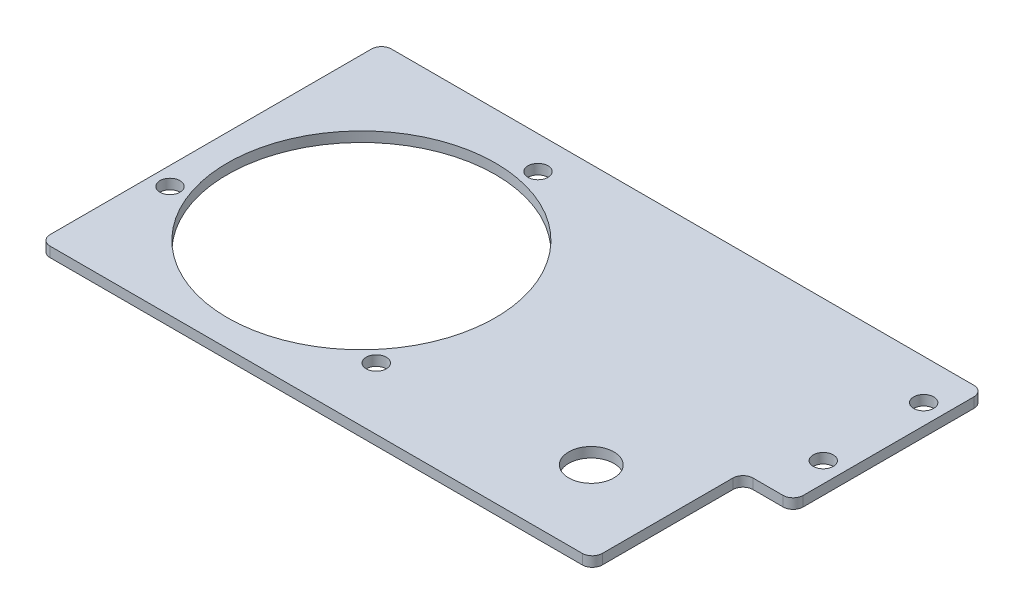
ISO-10303-21;
HEADER;
FILE_DESCRIPTION(('STEP AP214'),'2;1');
FILE_NAME('part.step','',(''),(''),'','','');
FILE_SCHEMA(('AUTOMOTIVE_DESIGN { 1 0 10303 214 1 1 1 1 }'));
ENDSEC;
DATA;
#1=APPLICATION_CONTEXT('core data for automotive mechanical design processes');
#2=APPLICATION_PROTOCOL_DEFINITION('international standard','automotive_design',2000,#1);
#3=PRODUCT_CONTEXT('',#1,'mechanical');
#4=PRODUCT('Part','Part','',(#3));
#5=PRODUCT_RELATED_PRODUCT_CATEGORY('part','',(#4));
#6=PRODUCT_DEFINITION_FORMATION('','',#4);
#7=PRODUCT_DEFINITION_CONTEXT('part definition',#1,'design');
#8=PRODUCT_DEFINITION('design','',#6,#7);
#9=PRODUCT_DEFINITION_SHAPE('','',#8);
#10=(LENGTH_UNIT() NAMED_UNIT(*) SI_UNIT(.MILLI.,.METRE.));
#11=(NAMED_UNIT(*) PLANE_ANGLE_UNIT() SI_UNIT($,.RADIAN.));
#12=(NAMED_UNIT(*) SI_UNIT($,.STERADIAN.) SOLID_ANGLE_UNIT());
#13=UNCERTAINTY_MEASURE_WITH_UNIT(LENGTH_MEASURE(1.E-05),#10,'distance_accuracy_value','');
#14=(GEOMETRIC_REPRESENTATION_CONTEXT(3) GLOBAL_UNCERTAINTY_ASSIGNED_CONTEXT((#13)) GLOBAL_UNIT_ASSIGNED_CONTEXT((#10,
#11,#12)) REPRESENTATION_CONTEXT('',''));
#15=CARTESIAN_POINT('',(0.,0.,0.));
#16=DIRECTION('',(0.,0.,1.));
#17=DIRECTION('',(1.,0.,0.));
#18=AXIS2_PLACEMENT_3D('',#15,#16,#17);
#19=CARTESIAN_POINT('',(254.,6.35,12.7));
#20=DIRECTION('',(0.,-1.,0.));
#21=DIRECTION('',(0.,0.,-1.));
#22=AXIS2_PLACEMENT_3D('',#19,#20,#21);
#23=PLANE('',#22);
#24=CARTESIAN_POINT('',(195.686680000023,6.35,50.2920000000027));
#25=DIRECTION('',(0.,1.,0.));
#26=DIRECTION('',(0.,0.,1.));
#27=AXIS2_PLACEMENT_3D('',#24,#25,#26);
#28=CIRCLE('',#27,14.2875);
#29=CARTESIAN_POINT('',(195.686680000023,6.35,64.5795000000027));
#30=VERTEX_POINT('',#29);
#31=EDGE_CURVE('E299',#30,#30,#28,.T.);
#32=ORIENTED_EDGE('',*,*,#31,.F.);
#33=EDGE_LOOP('',(#32));
#34=FACE_BOUND('',#33,.T.);
#35=CARTESIAN_POINT('',(18.1745568096169,6.35,-93.4999892233898));
#36=DIRECTION('',(0.,1.,0.));
#37=DIRECTION('',(0.,0.,1.));
#38=AXIS2_PLACEMENT_3D('',#35,#36,#37);
#39=CIRCLE('',#38,6.34999999999998);
#40=CARTESIAN_POINT('',(18.1745568096169,6.35,-87.1499892233898));
#41=VERTEX_POINT('',#40);
#42=EDGE_CURVE('E309',#41,#41,#39,.T.);
#43=ORIENTED_EDGE('',*,*,#42,.F.);
#44=EDGE_LOOP('',(#43));
#45=FACE_BOUND('',#44,.T.);
#46=CARTESIAN_POINT('',(266.7,6.35,-88.9000000000001));
#47=DIRECTION('',(0.,1.,0.));
#48=DIRECTION('',(0.,0.,1.));
#49=AXIS2_PLACEMENT_3D('',#46,#47,#48);
#50=CIRCLE('',#49,6.35);
#51=CARTESIAN_POINT('',(266.7,6.35,-82.5500000000001));
#52=VERTEX_POINT('',#51);
#53=EDGE_CURVE('E321',#52,#52,#50,.T.);
#54=ORIENTED_EDGE('',*,*,#53,.F.);
#55=EDGE_LOOP('',(#54));
#56=FACE_BOUND('',#55,.T.);
#57=CARTESIAN_POINT('',(0.,6.35,0.));
#58=DIRECTION('',(0.,1.,0.));
#59=DIRECTION('',(0.,0.,1.));
#60=AXIS2_PLACEMENT_3D('',#57,#58,#59);
#61=CIRCLE('',#60,84.7725);
#62=CARTESIAN_POINT('',(0.,6.35,84.7725));
#63=VERTEX_POINT('',#62);
#64=EDGE_CURVE('E159',#63,#63,#61,.T.);
#65=ORIENTED_EDGE('',*,*,#64,.F.);
#66=EDGE_LOOP('',(#65));
#67=FACE_BOUND('',#66,.T.);
#68=CARTESIAN_POINT('',(254.,6.35,12.7));
#69=DIRECTION('',(0.,-1.,0.));
#70=DIRECTION('',(0.,0.,-1.));
#71=AXIS2_PLACEMENT_3D('',#68,#69,#70);
#72=CIRCLE('',#71,6.35);
#73=CARTESIAN_POINT('',(247.65,6.35,12.7));
#74=VERTEX_POINT('',#73);
#75=CARTESIAN_POINT('',(254.,6.35,6.34999999999998));
#76=VERTEX_POINT('',#75);
#77=EDGE_CURVE('E178',#74,#76,#72,.T.);
#78=ORIENTED_EDGE('',*,*,#77,.T.);
#79=DIRECTION('',(1.,0.,0.));
#80=VECTOR('',#79,1.);
#81=CARTESIAN_POINT('',(254.,6.35,6.34999999999998));
#82=LINE('',#81,#80);
#83=CARTESIAN_POINT('',(273.05,6.35,6.34999999999999));
#84=VERTEX_POINT('',#83);
#85=EDGE_CURVE('E106',#76,#84,#82,.T.);
#86=ORIENTED_EDGE('',*,*,#85,.T.);
#87=CARTESIAN_POINT('',(273.05,6.35,0.));
#88=DIRECTION('',(0.,1.,0.));
#89=DIRECTION('',(0.,0.,1.));
#90=AXIS2_PLACEMENT_3D('',#87,#88,#89);
#91=CIRCLE('',#90,6.35000000000001);
#92=CARTESIAN_POINT('',(279.4,6.35,0.));
#93=VERTEX_POINT('',#92);
#94=EDGE_CURVE('E206',#84,#93,#91,.T.);
#95=ORIENTED_EDGE('',*,*,#94,.T.);
#96=DIRECTION('',(0.,0.,-1.));
#97=VECTOR('',#96,1.);
#98=CARTESIAN_POINT('',(279.4,6.35,-107.95));
#99=LINE('',#98,#97);
#100=CARTESIAN_POINT('',(279.4,6.35,-107.95));
#101=VERTEX_POINT('',#100);
#102=EDGE_CURVE('E225',#93,#101,#99,.T.);
#103=ORIENTED_EDGE('',*,*,#102,.T.);
#104=CARTESIAN_POINT('',(273.05,6.35,-107.95));
#105=DIRECTION('',(0.,1.,0.));
#106=DIRECTION('',(0.,0.,-1.));
#107=AXIS2_PLACEMENT_3D('',#104,#105,#106);
#108=CIRCLE('',#107,6.35000000000002);
#109=CARTESIAN_POINT('',(273.05,6.35,-114.3));
#110=VERTEX_POINT('',#109);
#111=EDGE_CURVE('E222',#101,#110,#108,.T.);
#112=ORIENTED_EDGE('',*,*,#111,.T.);
#113=DIRECTION('',(-1.,0.,0.));
#114=VECTOR('',#113,1.);
#115=CARTESIAN_POINT('',(273.05,6.35,-114.3));
#116=LINE('',#115,#114);
#117=CARTESIAN_POINT('',(-95.25,6.35,-114.3));
#118=VERTEX_POINT('',#117);
#119=EDGE_CURVE('E224',#110,#118,#116,.T.);
#120=ORIENTED_EDGE('',*,*,#119,.T.);
#121=CARTESIAN_POINT('',(-95.25,6.35,-107.95));
#122=DIRECTION('',(0.,1.,0.));
#123=DIRECTION('',(0.,0.,1.));
#124=AXIS2_PLACEMENT_3D('',#121,#122,#123);
#125=CIRCLE('',#124,6.35);
#126=CARTESIAN_POINT('',(-101.6,6.35,-107.95));
#127=VERTEX_POINT('',#126);
#128=EDGE_CURVE('E227',#118,#127,#125,.T.);
#129=ORIENTED_EDGE('',*,*,#128,.T.);
#130=DIRECTION('',(0.,0.,1.));
#131=VECTOR('',#130,1.);
#132=CARTESIAN_POINT('',(-101.6,6.35,-107.95));
#133=LINE('',#132,#131);
#134=CARTESIAN_POINT('',(-101.6,6.35,95.25));
#135=VERTEX_POINT('',#134);
#136=EDGE_CURVE('E233',#127,#135,#133,.T.);
#137=ORIENTED_EDGE('',*,*,#136,.T.);
#138=CARTESIAN_POINT('',(-95.2499999999999,6.35,95.2500000000001));
#139=DIRECTION('',(0.,1.,0.));
#140=DIRECTION('',(0.,0.,-1.));
#141=AXIS2_PLACEMENT_3D('',#138,#139,#140);
#142=CIRCLE('',#141,6.34999999999999);
#143=CARTESIAN_POINT('',(-95.2499999999999,6.35,101.6));
#144=VERTEX_POINT('',#143);
#145=EDGE_CURVE('E137',#135,#144,#142,.T.);
#146=ORIENTED_EDGE('',*,*,#145,.T.);
#147=DIRECTION('',(1.,0.,0.));
#148=VECTOR('',#147,1.);
#149=CARTESIAN_POINT('',(241.3,6.35,101.6));
#150=LINE('',#149,#148);
#151=CARTESIAN_POINT('',(241.3,6.35,101.6));
#152=VERTEX_POINT('',#151);
#153=EDGE_CURVE('E131',#144,#152,#150,.T.);
#154=ORIENTED_EDGE('',*,*,#153,.T.);
#155=CARTESIAN_POINT('',(241.3,6.35,95.25));
#156=DIRECTION('',(0.,1.,0.));
#157=DIRECTION('',(0.,0.,1.));
#158=AXIS2_PLACEMENT_3D('',#155,#156,#157);
#159=CIRCLE('',#158,6.34999999999999);
#160=CARTESIAN_POINT('',(247.65,6.35,95.25));
#161=VERTEX_POINT('',#160);
#162=EDGE_CURVE('E135',#152,#161,#159,.T.);
#163=ORIENTED_EDGE('',*,*,#162,.T.);
#164=DIRECTION('',(0.,0.,-1.));
#165=VECTOR('',#164,1.);
#166=CARTESIAN_POINT('',(247.65,6.35,95.25));
#167=LINE('',#166,#165);
#168=EDGE_CURVE('E51',#161,#74,#167,.T.);
#169=ORIENTED_EDGE('',*,*,#168,.T.);
#170=EDGE_LOOP('',(#78,#86,#95,#103,#112,#120,#129,#137,#146,#154,#163,#169));
#171=FACE_BOUND('',#170,.T.);
#172=CARTESIAN_POINT('',(-90.0606443258351,6.35,31.0103667120436));
#173=DIRECTION('',(0.,1.,0.));
#174=DIRECTION('',(0.,0.,1.));
#175=AXIS2_PLACEMENT_3D('',#172,#173,#174);
#176=CIRCLE('',#175,6.35);
#177=CARTESIAN_POINT('',(-90.0606443258351,6.35,37.3603667120436));
#178=VERTEX_POINT('',#177);
#179=EDGE_CURVE('E327',#178,#178,#176,.T.);
#180=ORIENTED_EDGE('',*,*,#179,.F.);
#181=EDGE_LOOP('',(#180));
#182=FACE_BOUND('',#181,.T.);
#183=CARTESIAN_POINT('',(266.7,6.35,-25.4000000000001));
#184=DIRECTION('',(0.,1.,0.));
#185=DIRECTION('',(0.,0.,1.));
#186=AXIS2_PLACEMENT_3D('',#183,#184,#185);
#187=CIRCLE('',#186,6.35);
#188=CARTESIAN_POINT('',(266.7,6.35,-19.0500000000001));
#189=VERTEX_POINT('',#188);
#190=EDGE_CURVE('E315',#189,#189,#187,.T.);
#191=ORIENTED_EDGE('',*,*,#190,.F.);
#192=EDGE_LOOP('',(#191));
#193=FACE_BOUND('',#192,.T.);
#194=CARTESIAN_POINT('',(71.8860875162181,6.35,62.4896225113469));
#195=DIRECTION('',(0.,1.,0.));
#196=DIRECTION('',(0.,0.,1.));
#197=AXIS2_PLACEMENT_3D('',#194,#195,#196);
#198=CIRCLE('',#197,6.35);
#199=CARTESIAN_POINT('',(71.8860875162181,6.35,68.8396225113469));
#200=VERTEX_POINT('',#199);
#201=EDGE_CURVE('E303',#200,#200,#198,.T.);
#202=ORIENTED_EDGE('',*,*,#201,.F.);
#203=EDGE_LOOP('',(#202));
#204=FACE_BOUND('',#203,.T.);
#205=ADVANCED_FACE('F33',(#34,#45,#56,#67,#171,#182,#193,#204),#23,.F.);
#206=CARTESIAN_POINT('',(254.,0.,12.7));
#207=DIRECTION('',(0.,-1.,0.));
#208=DIRECTION('',(0.,0.,-1.));
#209=AXIS2_PLACEMENT_3D('',#206,#207,#208);
#210=PLANE('',#209);
#211=CARTESIAN_POINT('',(195.686680000023,0.,50.2920000000027));
#212=DIRECTION('',(0.,-1.,0.));
#213=DIRECTION('',(0.,0.,-1.));
#214=AXIS2_PLACEMENT_3D('',#211,#212,#213);
#215=CIRCLE('',#214,14.2875);
#216=CARTESIAN_POINT('',(195.686680000023,0.,36.0045000000027));
#217=VERTEX_POINT('',#216);
#218=EDGE_CURVE('E37',#217,#217,#215,.T.);
#219=ORIENTED_EDGE('',*,*,#218,.F.);
#220=EDGE_LOOP('',(#219));
#221=FACE_BOUND('',#220,.T.);
#222=CARTESIAN_POINT('',(18.1745568096169,0.,-93.4999892233898));
#223=DIRECTION('',(0.,1.,0.));
#224=DIRECTION('',(0.,0.,1.));
#225=AXIS2_PLACEMENT_3D('',#222,#223,#224);
#226=CIRCLE('',#225,6.34999999999998);
#227=CARTESIAN_POINT('',(18.1745568096169,0.,-87.1499892233898));
#228=VERTEX_POINT('',#227);
#229=EDGE_CURVE('E306',#228,#228,#226,.T.);
#230=ORIENTED_EDGE('',*,*,#229,.T.);
#231=EDGE_LOOP('',(#230));
#232=FACE_BOUND('',#231,.T.);
#233=CARTESIAN_POINT('',(266.7,0.,-88.9000000000001));
#234=DIRECTION('',(0.,1.,0.));
#235=DIRECTION('',(0.,0.,1.));
#236=AXIS2_PLACEMENT_3D('',#233,#234,#235);
#237=CIRCLE('',#236,6.35);
#238=CARTESIAN_POINT('',(266.7,0.,-82.5500000000001));
#239=VERTEX_POINT('',#238);
#240=EDGE_CURVE('E318',#239,#239,#237,.T.);
#241=ORIENTED_EDGE('',*,*,#240,.T.);
#242=EDGE_LOOP('',(#241));
#243=FACE_BOUND('',#242,.T.);
#244=CARTESIAN_POINT('',(0.,0.,0.));
#245=DIRECTION('',(0.,1.,0.));
#246=DIRECTION('',(0.,0.,1.));
#247=AXIS2_PLACEMENT_3D('',#244,#245,#246);
#248=CIRCLE('',#247,84.7725);
#249=CARTESIAN_POINT('',(0.,0.,84.7725));
#250=VERTEX_POINT('',#249);
#251=EDGE_CURVE('E330',#250,#250,#248,.T.);
#252=ORIENTED_EDGE('',*,*,#251,.T.);
#253=EDGE_LOOP('',(#252));
#254=FACE_BOUND('',#253,.T.);
#255=CARTESIAN_POINT('',(254.,0.,12.7));
#256=DIRECTION('',(0.,-1.,0.));
#257=DIRECTION('',(0.,0.,-1.));
#258=AXIS2_PLACEMENT_3D('',#255,#256,#257);
#259=CIRCLE('',#258,6.35);
#260=CARTESIAN_POINT('',(247.65,0.,12.7));
#261=VERTEX_POINT('',#260);
#262=CARTESIAN_POINT('',(254.,0.,6.34999999999998));
#263=VERTEX_POINT('',#262);
#264=EDGE_CURVE('E155',#261,#263,#259,.T.);
#265=ORIENTED_EDGE('',*,*,#264,.F.);
#266=DIRECTION('',(0.,0.,-1.));
#267=VECTOR('',#266,1.);
#268=CARTESIAN_POINT('',(247.65,0.,95.25));
#269=LINE('',#268,#267);
#270=CARTESIAN_POINT('',(247.65,0.,95.25));
#271=VERTEX_POINT('',#270);
#272=EDGE_CURVE('E98',#271,#261,#269,.T.);
#273=ORIENTED_EDGE('',*,*,#272,.F.);
#274=CARTESIAN_POINT('',(241.3,0.,95.25));
#275=DIRECTION('',(0.,1.,0.));
#276=DIRECTION('',(0.,0.,1.));
#277=AXIS2_PLACEMENT_3D('',#274,#275,#276);
#278=CIRCLE('',#277,6.34999999999999);
#279=CARTESIAN_POINT('',(241.3,0.,101.6));
#280=VERTEX_POINT('',#279);
#281=EDGE_CURVE('E92',#280,#271,#278,.T.);
#282=ORIENTED_EDGE('',*,*,#281,.F.);
#283=DIRECTION('',(1.,0.,0.));
#284=VECTOR('',#283,1.);
#285=CARTESIAN_POINT('',(241.3,0.,101.6));
#286=LINE('',#285,#284);
#287=CARTESIAN_POINT('',(-95.2499999999999,0.,101.6));
#288=VERTEX_POINT('',#287);
#289=EDGE_CURVE('E145',#288,#280,#286,.T.);
#290=ORIENTED_EDGE('',*,*,#289,.F.);
#291=CARTESIAN_POINT('',(-95.2499999999999,0.,95.2500000000001));
#292=DIRECTION('',(0.,1.,0.));
#293=DIRECTION('',(0.,0.,-1.));
#294=AXIS2_PLACEMENT_3D('',#291,#292,#293);
#295=CIRCLE('',#294,6.34999999999999);
#296=CARTESIAN_POINT('',(-101.6,0.,95.25));
#297=VERTEX_POINT('',#296);
#298=EDGE_CURVE('E173',#297,#288,#295,.T.);
#299=ORIENTED_EDGE('',*,*,#298,.F.);
#300=DIRECTION('',(0.,0.,1.));
#301=VECTOR('',#300,1.);
#302=CARTESIAN_POINT('',(-101.6,0.,-107.95));
#303=LINE('',#302,#301);
#304=CARTESIAN_POINT('',(-101.6,0.,-107.95));
#305=VERTEX_POINT('',#304);
#306=EDGE_CURVE('E171',#305,#297,#303,.T.);
#307=ORIENTED_EDGE('',*,*,#306,.F.);
#308=CARTESIAN_POINT('',(-95.25,0.,-107.95));
#309=DIRECTION('',(0.,1.,0.));
#310=DIRECTION('',(0.,0.,1.));
#311=AXIS2_PLACEMENT_3D('',#308,#309,#310);
#312=CIRCLE('',#311,6.35);
#313=CARTESIAN_POINT('',(-95.25,0.,-114.3));
#314=VERTEX_POINT('',#313);
#315=EDGE_CURVE('E169',#314,#305,#312,.T.);
#316=ORIENTED_EDGE('',*,*,#315,.F.);
#317=DIRECTION('',(-1.,0.,0.));
#318=VECTOR('',#317,1.);
#319=CARTESIAN_POINT('',(273.05,0.,-114.3));
#320=LINE('',#319,#318);
#321=CARTESIAN_POINT('',(273.05,0.,-114.3));
#322=VERTEX_POINT('',#321);
#323=EDGE_CURVE('E167',#322,#314,#320,.T.);
#324=ORIENTED_EDGE('',*,*,#323,.F.);
#325=CARTESIAN_POINT('',(273.05,0.,-107.95));
#326=DIRECTION('',(0.,1.,0.));
#327=DIRECTION('',(0.,0.,-1.));
#328=AXIS2_PLACEMENT_3D('',#325,#326,#327);
#329=CIRCLE('',#328,6.35000000000002);
#330=CARTESIAN_POINT('',(279.4,0.,-107.95));
#331=VERTEX_POINT('',#330);
#332=EDGE_CURVE('E165',#331,#322,#329,.T.);
#333=ORIENTED_EDGE('',*,*,#332,.F.);
#334=DIRECTION('',(0.,0.,-1.));
#335=VECTOR('',#334,1.);
#336=CARTESIAN_POINT('',(279.4,0.,-107.95));
#337=LINE('',#336,#335);
#338=CARTESIAN_POINT('',(279.4,0.,0.));
#339=VERTEX_POINT('',#338);
#340=EDGE_CURVE('E163',#339,#331,#337,.T.);
#341=ORIENTED_EDGE('',*,*,#340,.F.);
#342=CARTESIAN_POINT('',(273.05,0.,0.));
#343=DIRECTION('',(0.,1.,0.));
#344=DIRECTION('',(0.,0.,1.));
#345=AXIS2_PLACEMENT_3D('',#342,#343,#344);
#346=CIRCLE('',#345,6.35000000000001);
#347=CARTESIAN_POINT('',(273.05,0.,6.34999999999999));
#348=VERTEX_POINT('',#347);
#349=EDGE_CURVE('E161',#348,#339,#346,.T.);
#350=ORIENTED_EDGE('',*,*,#349,.F.);
#351=DIRECTION('',(1.,0.,0.));
#352=VECTOR('',#351,1.);
#353=CARTESIAN_POINT('',(254.,0.,6.34999999999998));
#354=LINE('',#353,#352);
#355=EDGE_CURVE('E158',#263,#348,#354,.T.);
#356=ORIENTED_EDGE('',*,*,#355,.F.);
#357=EDGE_LOOP('',(#265,#273,#282,#290,#299,#307,#316,#324,#333,#341,#350,#356));
#358=FACE_BOUND('',#357,.T.);
#359=CARTESIAN_POINT('',(-90.0606443258351,0.,31.0103667120436));
#360=DIRECTION('',(0.,1.,0.));
#361=DIRECTION('',(0.,0.,1.));
#362=AXIS2_PLACEMENT_3D('',#359,#360,#361);
#363=CIRCLE('',#362,6.35);
#364=CARTESIAN_POINT('',(-90.0606443258351,0.,37.3603667120436));
#365=VERTEX_POINT('',#364);
#366=EDGE_CURVE('E324',#365,#365,#363,.T.);
#367=ORIENTED_EDGE('',*,*,#366,.T.);
#368=EDGE_LOOP('',(#367));
#369=FACE_BOUND('',#368,.T.);
#370=CARTESIAN_POINT('',(266.7,0.,-25.4000000000001));
#371=DIRECTION('',(0.,1.,0.));
#372=DIRECTION('',(0.,0.,1.));
#373=AXIS2_PLACEMENT_3D('',#370,#371,#372);
#374=CIRCLE('',#373,6.35);
#375=CARTESIAN_POINT('',(266.7,0.,-19.0500000000001));
#376=VERTEX_POINT('',#375);
#377=EDGE_CURVE('E312',#376,#376,#374,.T.);
#378=ORIENTED_EDGE('',*,*,#377,.T.);
#379=EDGE_LOOP('',(#378));
#380=FACE_BOUND('',#379,.T.);
#381=CARTESIAN_POINT('',(71.8860875162181,0.,62.4896225113469));
#382=DIRECTION('',(0.,1.,0.));
#383=DIRECTION('',(0.,0.,1.));
#384=AXIS2_PLACEMENT_3D('',#381,#382,#383);
#385=CIRCLE('',#384,6.35);
#386=CARTESIAN_POINT('',(71.8860875162181,0.,68.8396225113469));
#387=VERTEX_POINT('',#386);
#388=EDGE_CURVE('E301',#387,#387,#385,.T.);
#389=ORIENTED_EDGE('',*,*,#388,.T.);
#390=EDGE_LOOP('',(#389));
#391=FACE_BOUND('',#390,.T.);
#392=ADVANCED_FACE('F210',(#221,#232,#243,#254,#358,#369,#380,#391),#210,.T.);
#393=CARTESIAN_POINT('',(254.,6.35,12.7));
#394=DIRECTION('',(0.,-1.,0.));
#395=DIRECTION('',(0.,0.,-1.));
#396=AXIS2_PLACEMENT_3D('',#393,#394,#395);
#397=CYLINDRICAL_SURFACE('',#396,6.35);
#398=ORIENTED_EDGE('',*,*,#264,.T.);
#399=DIRECTION('',(0.,-1.,0.));
#400=VECTOR('',#399,1.);
#401=CARTESIAN_POINT('',(254.,6.35,6.34999999999998));
#402=LINE('',#401,#400);
#403=EDGE_CURVE('E11',#76,#263,#402,.T.);
#404=ORIENTED_EDGE('',*,*,#403,.F.);
#405=ORIENTED_EDGE('',*,*,#77,.F.);
#406=DIRECTION('',(0.,-1.,0.));
#407=VECTOR('',#406,1.);
#408=CARTESIAN_POINT('',(247.65,6.35,12.7));
#409=LINE('',#408,#407);
#410=EDGE_CURVE('E151',#74,#261,#409,.T.);
#411=ORIENTED_EDGE('',*,*,#410,.T.);
#412=EDGE_LOOP('',(#398,#404,#405,#411));
#413=FACE_BOUND('',#412,.T.);
#414=ADVANCED_FACE('F35',(#413),#397,.F.);
#415=CARTESIAN_POINT('',(254.,6.35,6.34999999999998));
#416=DIRECTION('',(0.,0.,-1.));
#417=DIRECTION('',(-1.,0.,0.));
#418=AXIS2_PLACEMENT_3D('',#415,#416,#417);
#419=PLANE('',#418);
#420=ORIENTED_EDGE('',*,*,#355,.T.);
#421=DIRECTION('',(0.,-1.,0.));
#422=VECTOR('',#421,1.);
#423=CARTESIAN_POINT('',(273.05,6.35,6.34999999999999));
#424=LINE('',#423,#422);
#425=EDGE_CURVE('E43',#84,#348,#424,.T.);
#426=ORIENTED_EDGE('',*,*,#425,.F.);
#427=ORIENTED_EDGE('',*,*,#85,.F.);
#428=ORIENTED_EDGE('',*,*,#403,.T.);
#429=EDGE_LOOP('',(#420,#426,#427,#428));
#430=FACE_BOUND('',#429,.T.);
#431=ADVANCED_FACE('F467',(#430),#419,.F.);
#432=CARTESIAN_POINT('',(273.05,6.35,0.));
#433=DIRECTION('',(0.,-1.,0.));
#434=DIRECTION('',(0.,0.,-1.));
#435=AXIS2_PLACEMENT_3D('',#432,#433,#434);
#436=CYLINDRICAL_SURFACE('',#435,6.35000000000001);
#437=ORIENTED_EDGE('',*,*,#349,.T.);
#438=DIRECTION('',(0.,-1.,0.));
#439=VECTOR('',#438,1.);
#440=CARTESIAN_POINT('',(279.4,6.35,0.));
#441=LINE('',#440,#439);
#442=EDGE_CURVE('E197',#93,#339,#441,.T.);
#443=ORIENTED_EDGE('',*,*,#442,.F.);
#444=ORIENTED_EDGE('',*,*,#94,.F.);
#445=ORIENTED_EDGE('',*,*,#425,.T.);
#446=EDGE_LOOP('',(#437,#443,#444,#445));
#447=FACE_BOUND('',#446,.T.);
#448=ADVANCED_FACE('F204',(#447),#436,.T.);
#449=CARTESIAN_POINT('',(279.4,6.35,-107.95));
#450=DIRECTION('',(-1.,0.,0.));
#451=DIRECTION('',(0.,0.,1.));
#452=AXIS2_PLACEMENT_3D('',#449,#450,#451);
#453=PLANE('',#452);
#454=ORIENTED_EDGE('',*,*,#340,.T.);
#455=DIRECTION('',(0.,-1.,0.));
#456=VECTOR('',#455,1.);
#457=CARTESIAN_POINT('',(279.4,6.35,-107.95));
#458=LINE('',#457,#456);
#459=EDGE_CURVE('E194',#101,#331,#458,.T.);
#460=ORIENTED_EDGE('',*,*,#459,.F.);
#461=ORIENTED_EDGE('',*,*,#102,.F.);
#462=ORIENTED_EDGE('',*,*,#442,.T.);
#463=EDGE_LOOP('',(#454,#460,#461,#462));
#464=FACE_BOUND('',#463,.T.);
#465=ADVANCED_FACE('F216',(#464),#453,.F.);
#466=CARTESIAN_POINT('',(273.05,6.35,-107.95));
#467=DIRECTION('',(0.,-1.,0.));
#468=DIRECTION('',(0.,0.,-1.));
#469=AXIS2_PLACEMENT_3D('',#466,#467,#468);
#470=CYLINDRICAL_SURFACE('',#469,6.35000000000002);
#471=ORIENTED_EDGE('',*,*,#332,.T.);
#472=DIRECTION('',(0.,-1.,0.));
#473=VECTOR('',#472,1.);
#474=CARTESIAN_POINT('',(273.05,6.35,-114.3));
#475=LINE('',#474,#473);
#476=EDGE_CURVE('E191',#110,#322,#475,.T.);
#477=ORIENTED_EDGE('',*,*,#476,.F.);
#478=ORIENTED_EDGE('',*,*,#111,.F.);
#479=ORIENTED_EDGE('',*,*,#459,.T.);
#480=EDGE_LOOP('',(#471,#477,#478,#479));
#481=FACE_BOUND('',#480,.T.);
#482=ADVANCED_FACE('F220',(#481),#470,.T.);
#483=CARTESIAN_POINT('',(273.05,6.35,-114.3));
#484=DIRECTION('',(0.,0.,1.));
#485=DIRECTION('',(1.,0.,0.));
#486=AXIS2_PLACEMENT_3D('',#483,#484,#485);
#487=PLANE('',#486);
#488=ORIENTED_EDGE('',*,*,#323,.T.);
#489=DIRECTION('',(0.,-1.,0.));
#490=VECTOR('',#489,1.);
#491=CARTESIAN_POINT('',(-95.25,6.35,-114.3));
#492=LINE('',#491,#490);
#493=EDGE_CURVE('E188',#118,#314,#492,.T.);
#494=ORIENTED_EDGE('',*,*,#493,.F.);
#495=ORIENTED_EDGE('',*,*,#119,.F.);
#496=ORIENTED_EDGE('',*,*,#476,.T.);
#497=EDGE_LOOP('',(#488,#494,#495,#496));
#498=FACE_BOUND('',#497,.T.);
#499=ADVANCED_FACE('F432',(#498),#487,.F.);
#500=CARTESIAN_POINT('',(-95.25,6.35,-107.95));
#501=DIRECTION('',(0.,-1.,0.));
#502=DIRECTION('',(0.,0.,-1.));
#503=AXIS2_PLACEMENT_3D('',#500,#501,#502);
#504=CYLINDRICAL_SURFACE('',#503,6.35);
#505=ORIENTED_EDGE('',*,*,#315,.T.);
#506=DIRECTION('',(0.,-1.,0.));
#507=VECTOR('',#506,1.);
#508=CARTESIAN_POINT('',(-101.6,6.35,-107.95));
#509=LINE('',#508,#507);
#510=EDGE_CURVE('E185',#127,#305,#509,.T.);
#511=ORIENTED_EDGE('',*,*,#510,.F.);
#512=ORIENTED_EDGE('',*,*,#128,.F.);
#513=ORIENTED_EDGE('',*,*,#493,.T.);
#514=EDGE_LOOP('',(#505,#511,#512,#513));
#515=FACE_BOUND('',#514,.T.);
#516=ADVANCED_FACE('F423',(#515),#504,.T.);
#517=CARTESIAN_POINT('',(-101.6,6.35,-107.95));
#518=DIRECTION('',(1.,0.,0.));
#519=DIRECTION('',(0.,0.,-1.));
#520=AXIS2_PLACEMENT_3D('',#517,#518,#519);
#521=PLANE('',#520);
#522=ORIENTED_EDGE('',*,*,#306,.T.);
#523=DIRECTION('',(0.,-1.,0.));
#524=VECTOR('',#523,1.);
#525=CARTESIAN_POINT('',(-101.6,6.35,95.25));
#526=LINE('',#525,#524);
#527=EDGE_CURVE('E182',#135,#297,#526,.T.);
#528=ORIENTED_EDGE('',*,*,#527,.F.);
#529=ORIENTED_EDGE('',*,*,#136,.F.);
#530=ORIENTED_EDGE('',*,*,#510,.T.);
#531=EDGE_LOOP('',(#522,#528,#529,#530));
#532=FACE_BOUND('',#531,.T.);
#533=ADVANCED_FACE('F239',(#532),#521,.F.);
#534=CARTESIAN_POINT('',(-95.2499999999999,6.35,95.2500000000001));
#535=DIRECTION('',(0.,-1.,0.));
#536=DIRECTION('',(0.,0.,-1.));
#537=AXIS2_PLACEMENT_3D('',#534,#535,#536);
#538=CYLINDRICAL_SURFACE('',#537,6.34999999999999);
#539=ORIENTED_EDGE('',*,*,#298,.T.);
#540=DIRECTION('',(0.,-1.,0.));
#541=VECTOR('',#540,1.);
#542=CARTESIAN_POINT('',(-95.2499999999999,6.35,101.6));
#543=LINE('',#542,#541);
#544=EDGE_CURVE('E146',#144,#288,#543,.T.);
#545=ORIENTED_EDGE('',*,*,#544,.F.);
#546=ORIENTED_EDGE('',*,*,#145,.F.);
#547=ORIENTED_EDGE('',*,*,#527,.T.);
#548=EDGE_LOOP('',(#539,#545,#546,#547));
#549=FACE_BOUND('',#548,.T.);
#550=ADVANCED_FACE('F243',(#549),#538,.T.);
#551=CARTESIAN_POINT('',(241.3,6.35,101.6));
#552=DIRECTION('',(0.,0.,-1.));
#553=DIRECTION('',(-1.,0.,0.));
#554=AXIS2_PLACEMENT_3D('',#551,#552,#553);
#555=PLANE('',#554);
#556=ORIENTED_EDGE('',*,*,#289,.T.);
#557=DIRECTION('',(0.,-1.,0.));
#558=VECTOR('',#557,1.);
#559=CARTESIAN_POINT('',(241.3,6.35,101.6));
#560=LINE('',#559,#558);
#561=EDGE_CURVE('E142',#152,#280,#560,.T.);
#562=ORIENTED_EDGE('',*,*,#561,.F.);
#563=ORIENTED_EDGE('',*,*,#153,.F.);
#564=ORIENTED_EDGE('',*,*,#544,.T.);
#565=EDGE_LOOP('',(#556,#562,#563,#564));
#566=FACE_BOUND('',#565,.T.);
#567=ADVANCED_FACE('F143',(#566),#555,.F.);
#568=CARTESIAN_POINT('',(241.3,6.35,95.25));
#569=DIRECTION('',(0.,-1.,0.));
#570=DIRECTION('',(0.,0.,-1.));
#571=AXIS2_PLACEMENT_3D('',#568,#569,#570);
#572=CYLINDRICAL_SURFACE('',#571,6.34999999999999);
#573=ORIENTED_EDGE('',*,*,#281,.T.);
#574=DIRECTION('',(0.,-1.,0.));
#575=VECTOR('',#574,1.);
#576=CARTESIAN_POINT('',(247.65,6.35,95.25));
#577=LINE('',#576,#575);
#578=EDGE_CURVE('E147',#161,#271,#577,.T.);
#579=ORIENTED_EDGE('',*,*,#578,.F.);
#580=ORIENTED_EDGE('',*,*,#162,.F.);
#581=ORIENTED_EDGE('',*,*,#561,.T.);
#582=EDGE_LOOP('',(#573,#579,#580,#581));
#583=FACE_BOUND('',#582,.T.);
#584=ADVANCED_FACE('F149',(#583),#572,.T.);
#585=CARTESIAN_POINT('',(247.65,6.35,95.25));
#586=DIRECTION('',(-1.,0.,0.));
#587=DIRECTION('',(0.,0.,1.));
#588=AXIS2_PLACEMENT_3D('',#585,#586,#587);
#589=PLANE('',#588);
#590=ORIENTED_EDGE('',*,*,#272,.T.);
#591=ORIENTED_EDGE('',*,*,#410,.F.);
#592=ORIENTED_EDGE('',*,*,#168,.F.);
#593=ORIENTED_EDGE('',*,*,#578,.T.);
#594=EDGE_LOOP('',(#590,#591,#592,#593));
#595=FACE_BOUND('',#594,.T.);
#596=ADVANCED_FACE('F247',(#595),#589,.F.);
#597=CARTESIAN_POINT('',(0.,6.35,0.));
#598=DIRECTION('',(0.,-1.,0.));
#599=DIRECTION('',(0.,0.,-1.));
#600=AXIS2_PLACEMENT_3D('',#597,#598,#599);
#601=CYLINDRICAL_SURFACE('',#600,84.7725);
#602=ORIENTED_EDGE('',*,*,#64,.T.);
#603=EDGE_LOOP('',(#602));
#604=FACE_BOUND('',#603,.T.);
#605=ORIENTED_EDGE('',*,*,#251,.F.);
#606=EDGE_LOOP('',(#605));
#607=FACE_BOUND('',#606,.T.);
#608=ADVANCED_FACE('F249',(#604,#607),#601,.F.);
#609=CARTESIAN_POINT('',(-90.0606443258351,6.35,31.0103667120436));
#610=DIRECTION('',(0.,-1.,0.));
#611=DIRECTION('',(0.,0.,-1.));
#612=AXIS2_PLACEMENT_3D('',#609,#610,#611);
#613=CYLINDRICAL_SURFACE('',#612,6.35);
#614=ORIENTED_EDGE('',*,*,#179,.T.);
#615=EDGE_LOOP('',(#614));
#616=FACE_BOUND('',#615,.T.);
#617=ORIENTED_EDGE('',*,*,#366,.F.);
#618=EDGE_LOOP('',(#617));
#619=FACE_BOUND('',#618,.T.);
#620=ADVANCED_FACE('F255',(#616,#619),#613,.F.);
#621=CARTESIAN_POINT('',(266.7,6.35,-88.9000000000001));
#622=DIRECTION('',(0.,-1.,0.));
#623=DIRECTION('',(0.,0.,-1.));
#624=AXIS2_PLACEMENT_3D('',#621,#622,#623);
#625=CYLINDRICAL_SURFACE('',#624,6.35);
#626=ORIENTED_EDGE('',*,*,#53,.T.);
#627=EDGE_LOOP('',(#626));
#628=FACE_BOUND('',#627,.T.);
#629=ORIENTED_EDGE('',*,*,#240,.F.);
#630=EDGE_LOOP('',(#629));
#631=FACE_BOUND('',#630,.T.);
#632=ADVANCED_FACE('F273',(#628,#631),#625,.F.);
#633=CARTESIAN_POINT('',(266.7,6.35,-25.4000000000001));
#634=DIRECTION('',(0.,-1.,0.));
#635=DIRECTION('',(0.,0.,-1.));
#636=AXIS2_PLACEMENT_3D('',#633,#634,#635);
#637=CYLINDRICAL_SURFACE('',#636,6.35);
#638=ORIENTED_EDGE('',*,*,#190,.T.);
#639=EDGE_LOOP('',(#638));
#640=FACE_BOUND('',#639,.T.);
#641=ORIENTED_EDGE('',*,*,#377,.F.);
#642=EDGE_LOOP('',(#641));
#643=FACE_BOUND('',#642,.T.);
#644=ADVANCED_FACE('F277',(#640,#643),#637,.F.);
#645=CARTESIAN_POINT('',(18.1745568096169,6.35,-93.4999892233898));
#646=DIRECTION('',(0.,-1.,0.));
#647=DIRECTION('',(0.,0.,-1.));
#648=AXIS2_PLACEMENT_3D('',#645,#646,#647);
#649=CYLINDRICAL_SURFACE('',#648,6.34999999999998);
#650=ORIENTED_EDGE('',*,*,#42,.T.);
#651=EDGE_LOOP('',(#650));
#652=FACE_BOUND('',#651,.T.);
#653=ORIENTED_EDGE('',*,*,#229,.F.);
#654=EDGE_LOOP('',(#653));
#655=FACE_BOUND('',#654,.T.);
#656=ADVANCED_FACE('F281',(#652,#655),#649,.F.);
#657=CARTESIAN_POINT('',(71.8860875162181,6.35,62.4896225113469));
#658=DIRECTION('',(0.,-1.,0.));
#659=DIRECTION('',(0.,0.,-1.));
#660=AXIS2_PLACEMENT_3D('',#657,#658,#659);
#661=CYLINDRICAL_SURFACE('',#660,6.35);
#662=ORIENTED_EDGE('',*,*,#201,.T.);
#663=EDGE_LOOP('',(#662));
#664=FACE_BOUND('',#663,.T.);
#665=ORIENTED_EDGE('',*,*,#388,.F.);
#666=EDGE_LOOP('',(#665));
#667=FACE_BOUND('',#666,.T.);
#668=ADVANCED_FACE('F285',(#664,#667),#661,.F.);
#669=CARTESIAN_POINT('',(195.686680000023,-3.302,50.2920000000027));
#670=DIRECTION('',(0.,1.,0.));
#671=DIRECTION('',(0.,0.,1.));
#672=AXIS2_PLACEMENT_3D('',#669,#670,#671);
#673=CYLINDRICAL_SURFACE('',#672,14.2875);
#674=ORIENTED_EDGE('',*,*,#218,.T.);
#675=EDGE_LOOP('',(#674));
#676=FACE_BOUND('',#675,.T.);
#677=ORIENTED_EDGE('',*,*,#31,.T.);
#678=EDGE_LOOP('',(#677));
#679=FACE_BOUND('',#678,.T.);
#680=ADVANCED_FACE('F289',(#676,#679),#673,.F.);
#681=CLOSED_SHELL('',(#205,#392,#414,#431,#448,#465,#482,#499,#516,#533,#550,#567,#584,#596,
#608,#620,#632,#644,#656,#668,#680));
#682=MANIFOLD_SOLID_BREP('B2',#681);
#683=ADVANCED_BREP_SHAPE_REPRESENTATION('',(#18,#682),#14);
#684=SHAPE_DEFINITION_REPRESENTATION(#9,#683);
ENDSEC;
END-ISO-10303-21;
